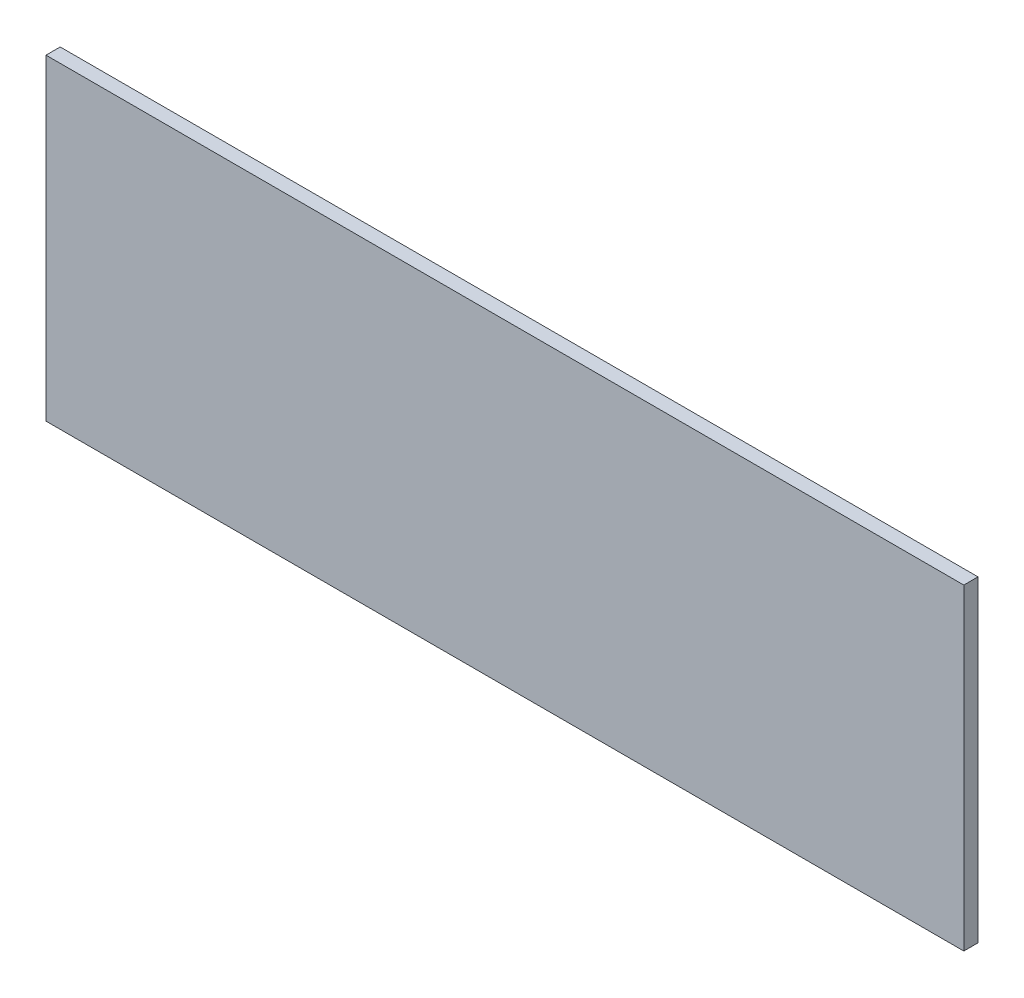
ISO-10303-21;
HEADER;
FILE_DESCRIPTION(('STEP AP214'),'2;1');
FILE_NAME('part.step','',(''),(''),'','','');
FILE_SCHEMA(('AUTOMOTIVE_DESIGN { 1 0 10303 214 1 1 1 1 }'));
ENDSEC;
DATA;
#1=APPLICATION_CONTEXT('core data for automotive mechanical design processes');
#2=APPLICATION_PROTOCOL_DEFINITION('international standard','automotive_design',2000,#1);
#3=PRODUCT_CONTEXT('',#1,'mechanical');
#4=PRODUCT('Part','Part','',(#3));
#5=PRODUCT_RELATED_PRODUCT_CATEGORY('part','',(#4));
#6=PRODUCT_DEFINITION_FORMATION('','',#4);
#7=PRODUCT_DEFINITION_CONTEXT('part definition',#1,'design');
#8=PRODUCT_DEFINITION('design','',#6,#7);
#9=PRODUCT_DEFINITION_SHAPE('','',#8);
#10=(LENGTH_UNIT() NAMED_UNIT(*) SI_UNIT(.MILLI.,.METRE.));
#11=(NAMED_UNIT(*) PLANE_ANGLE_UNIT() SI_UNIT($,.RADIAN.));
#12=(NAMED_UNIT(*) SI_UNIT($,.STERADIAN.) SOLID_ANGLE_UNIT());
#13=UNCERTAINTY_MEASURE_WITH_UNIT(LENGTH_MEASURE(1.E-05),#10,'distance_accuracy_value','');
#14=(GEOMETRIC_REPRESENTATION_CONTEXT(3) GLOBAL_UNCERTAINTY_ASSIGNED_CONTEXT((#13)) GLOBAL_UNIT_ASSIGNED_CONTEXT((#10,
#11,#12)) REPRESENTATION_CONTEXT('',''));
#15=CARTESIAN_POINT('',(0.,0.,0.));
#16=DIRECTION('',(0.,0.,1.));
#17=DIRECTION('',(1.,0.,0.));
#18=AXIS2_PLACEMENT_3D('',#15,#16,#17);
#19=CARTESIAN_POINT('',(0.,0.,3.));
#20=DIRECTION('',(1.,0.,0.));
#21=DIRECTION('',(0.,0.,-1.));
#22=AXIS2_PLACEMENT_3D('',#19,#20,#21);
#23=PLANE('',#22);
#24=DIRECTION('',(0.,-1.,0.));
#25=VECTOR('',#24,1.);
#26=CARTESIAN_POINT('',(0.,0.,0.));
#27=LINE('',#26,#25);
#28=CARTESIAN_POINT('',(0.,67.,0.));
#29=VERTEX_POINT('',#28);
#30=CARTESIAN_POINT('',(0.,0.,0.));
#31=VERTEX_POINT('',#30);
#32=EDGE_CURVE('E108',#29,#31,#27,.T.);
#33=ORIENTED_EDGE('',*,*,#32,.T.);
#34=DIRECTION('',(0.,0.,-1.));
#35=VECTOR('',#34,1.);
#36=CARTESIAN_POINT('',(0.,0.,3.));
#37=LINE('',#36,#35);
#38=CARTESIAN_POINT('',(0.,0.,3.));
#39=VERTEX_POINT('',#38);
#40=EDGE_CURVE('E11',#39,#31,#37,.T.);
#41=ORIENTED_EDGE('',*,*,#40,.F.);
#42=DIRECTION('',(0.,-1.,0.));
#43=VECTOR('',#42,1.);
#44=CARTESIAN_POINT('',(0.,0.,3.));
#45=LINE('',#44,#43);
#46=CARTESIAN_POINT('',(0.,67.,3.));
#47=VERTEX_POINT('',#46);
#48=EDGE_CURVE('E92',#47,#39,#45,.T.);
#49=ORIENTED_EDGE('',*,*,#48,.F.);
#50=DIRECTION('',(0.,0.,-1.));
#51=VECTOR('',#50,1.);
#52=CARTESIAN_POINT('',(0.,67.,3.));
#53=LINE('',#52,#51);
#54=EDGE_CURVE('E105',#47,#29,#53,.T.);
#55=ORIENTED_EDGE('',*,*,#54,.T.);
#56=EDGE_LOOP('',(#33,#41,#49,#55));
#57=FACE_BOUND('',#56,.T.);
#58=ADVANCED_FACE('F43',(#57),#23,.F.);
#59=CARTESIAN_POINT('',(0.,0.,3.));
#60=DIRECTION('',(0.,1.,0.));
#61=DIRECTION('',(0.,0.,1.));
#62=AXIS2_PLACEMENT_3D('',#59,#60,#61);
#63=PLANE('',#62);
#64=DIRECTION('',(1.,0.,0.));
#65=VECTOR('',#64,1.);
#66=CARTESIAN_POINT('',(0.,0.,0.));
#67=LINE('',#66,#65);
#68=CARTESIAN_POINT('',(194.,0.,0.));
#69=VERTEX_POINT('',#68);
#70=EDGE_CURVE('E97',#31,#69,#67,.T.);
#71=ORIENTED_EDGE('',*,*,#70,.T.);
#72=DIRECTION('',(0.,0.,-1.));
#73=VECTOR('',#72,1.);
#74=CARTESIAN_POINT('',(194.,0.,3.));
#75=LINE('',#74,#73);
#76=CARTESIAN_POINT('',(194.,0.,3.));
#77=VERTEX_POINT('',#76);
#78=EDGE_CURVE('E51',#77,#69,#75,.T.);
#79=ORIENTED_EDGE('',*,*,#78,.F.);
#80=DIRECTION('',(1.,0.,0.));
#81=VECTOR('',#80,1.);
#82=CARTESIAN_POINT('',(0.,0.,3.));
#83=LINE('',#82,#81);
#84=EDGE_CURVE('E87',#39,#77,#83,.T.);
#85=ORIENTED_EDGE('',*,*,#84,.F.);
#86=ORIENTED_EDGE('',*,*,#40,.T.);
#87=EDGE_LOOP('',(#71,#79,#85,#86));
#88=FACE_BOUND('',#87,.T.);
#89=ADVANCED_FACE('F100',(#88),#63,.F.);
#90=CARTESIAN_POINT('',(194.,0.,3.));
#91=DIRECTION('',(-1.,0.,0.));
#92=DIRECTION('',(0.,0.,1.));
#93=AXIS2_PLACEMENT_3D('',#90,#91,#92);
#94=PLANE('',#93);
#95=DIRECTION('',(0.,1.,0.));
#96=VECTOR('',#95,1.);
#97=CARTESIAN_POINT('',(194.,0.,0.));
#98=LINE('',#97,#96);
#99=CARTESIAN_POINT('',(194.,67.,0.));
#100=VERTEX_POINT('',#99);
#101=EDGE_CURVE('E78',#69,#100,#98,.T.);
#102=ORIENTED_EDGE('',*,*,#101,.T.);
#103=DIRECTION('',(0.,0.,-1.));
#104=VECTOR('',#103,1.);
#105=CARTESIAN_POINT('',(194.,67.,3.));
#106=LINE('',#105,#104);
#107=CARTESIAN_POINT('',(194.,67.,3.));
#108=VERTEX_POINT('',#107);
#109=EDGE_CURVE('E98',#108,#100,#106,.T.);
#110=ORIENTED_EDGE('',*,*,#109,.F.);
#111=DIRECTION('',(0.,1.,0.));
#112=VECTOR('',#111,1.);
#113=CARTESIAN_POINT('',(194.,0.,3.));
#114=LINE('',#113,#112);
#115=EDGE_CURVE('E95',#77,#108,#114,.T.);
#116=ORIENTED_EDGE('',*,*,#115,.F.);
#117=ORIENTED_EDGE('',*,*,#78,.T.);
#118=EDGE_LOOP('',(#102,#110,#116,#117));
#119=FACE_BOUND('',#118,.T.);
#120=ADVANCED_FACE('F99',(#119),#94,.F.);
#121=CARTESIAN_POINT('',(0.,67.,3.));
#122=DIRECTION('',(0.,-1.,0.));
#123=DIRECTION('',(0.,0.,-1.));
#124=AXIS2_PLACEMENT_3D('',#121,#122,#123);
#125=PLANE('',#124);
#126=DIRECTION('',(-1.,0.,0.));
#127=VECTOR('',#126,1.);
#128=CARTESIAN_POINT('',(0.,67.,0.));
#129=LINE('',#128,#127);
#130=EDGE_CURVE('E85',#100,#29,#129,.T.);
#131=ORIENTED_EDGE('',*,*,#130,.T.);
#132=ORIENTED_EDGE('',*,*,#54,.F.);
#133=DIRECTION('',(-1.,0.,0.));
#134=VECTOR('',#133,1.);
#135=CARTESIAN_POINT('',(0.,67.,3.));
#136=LINE('',#135,#134);
#137=EDGE_CURVE('E56',#108,#47,#136,.T.);
#138=ORIENTED_EDGE('',*,*,#137,.F.);
#139=ORIENTED_EDGE('',*,*,#109,.T.);
#140=EDGE_LOOP('',(#131,#132,#138,#139));
#141=FACE_BOUND('',#140,.T.);
#142=ADVANCED_FACE('F111',(#141),#125,.F.);
#143=CARTESIAN_POINT('',(0.,0.,3.));
#144=DIRECTION('',(0.,0.,-1.));
#145=DIRECTION('',(-1.,0.,0.));
#146=AXIS2_PLACEMENT_3D('',#143,#144,#145);
#147=PLANE('',#146);
#148=ORIENTED_EDGE('',*,*,#48,.T.);
#149=ORIENTED_EDGE('',*,*,#84,.T.);
#150=ORIENTED_EDGE('',*,*,#115,.T.);
#151=ORIENTED_EDGE('',*,*,#137,.T.);
#152=EDGE_LOOP('',(#148,#149,#150,#151));
#153=FACE_BOUND('',#152,.T.);
#154=ADVANCED_FACE('F89',(#153),#147,.F.);
#155=CARTESIAN_POINT('',(0.,0.,0.));
#156=DIRECTION('',(0.,0.,-1.));
#157=DIRECTION('',(-1.,0.,0.));
#158=AXIS2_PLACEMENT_3D('',#155,#156,#157);
#159=PLANE('',#158);
#160=ORIENTED_EDGE('',*,*,#32,.F.);
#161=ORIENTED_EDGE('',*,*,#130,.F.);
#162=ORIENTED_EDGE('',*,*,#101,.F.);
#163=ORIENTED_EDGE('',*,*,#70,.F.);
#164=EDGE_LOOP('',(#160,#161,#162,#163));
#165=FACE_BOUND('',#164,.T.);
#166=ADVANCED_FACE('F116',(#165),#159,.T.);
#167=CLOSED_SHELL('',(#58,#89,#120,#142,#154,#166));
#168=MANIFOLD_SOLID_BREP('B2',#167);
#169=ADVANCED_BREP_SHAPE_REPRESENTATION('',(#18,#168),#14);
#170=SHAPE_DEFINITION_REPRESENTATION(#9,#169);
ENDSEC;
END-ISO-10303-21;
